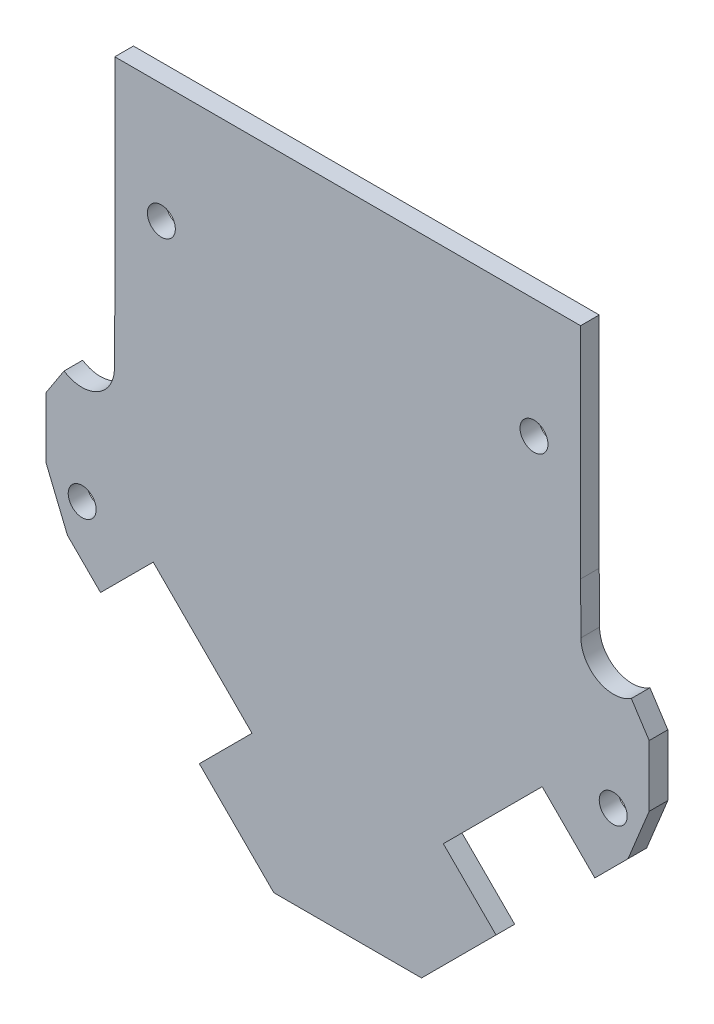
ISO-10303-21;
HEADER;
FILE_DESCRIPTION(('STEP AP214'),'2;1');
FILE_NAME('part.step','',(''),(''),'','','');
FILE_SCHEMA(('AUTOMOTIVE_DESIGN { 1 0 10303 214 1 1 1 1 }'));
ENDSEC;
DATA;
#1=APPLICATION_CONTEXT('core data for automotive mechanical design processes');
#2=APPLICATION_PROTOCOL_DEFINITION('international standard','automotive_design',2000,#1);
#3=PRODUCT_CONTEXT('',#1,'mechanical');
#4=PRODUCT('Part','Part','',(#3));
#5=PRODUCT_RELATED_PRODUCT_CATEGORY('part','',(#4));
#6=PRODUCT_DEFINITION_FORMATION('','',#4);
#7=PRODUCT_DEFINITION_CONTEXT('part definition',#1,'design');
#8=PRODUCT_DEFINITION('design','',#6,#7);
#9=PRODUCT_DEFINITION_SHAPE('','',#8);
#10=(LENGTH_UNIT() NAMED_UNIT(*) SI_UNIT(.MILLI.,.METRE.));
#11=(NAMED_UNIT(*) PLANE_ANGLE_UNIT() SI_UNIT($,.RADIAN.));
#12=(NAMED_UNIT(*) SI_UNIT($,.STERADIAN.) SOLID_ANGLE_UNIT());
#13=UNCERTAINTY_MEASURE_WITH_UNIT(LENGTH_MEASURE(1.E-05),#10,'distance_accuracy_value','');
#14=(GEOMETRIC_REPRESENTATION_CONTEXT(3) GLOBAL_UNCERTAINTY_ASSIGNED_CONTEXT((#13)) GLOBAL_UNIT_ASSIGNED_CONTEXT((#10,
#11,#12)) REPRESENTATION_CONTEXT('',''));
#15=CARTESIAN_POINT('',(0.,0.,0.));
#16=DIRECTION('',(0.,0.,1.));
#17=DIRECTION('',(1.,0.,0.));
#18=AXIS2_PLACEMENT_3D('',#15,#16,#17);
#19=CARTESIAN_POINT('',(15.,26.3525492114366,-37.569097949596));
#20=DIRECTION('',(-0.838670567945423,-0.544639035015028,0.));
#21=DIRECTION('',(0.544639035015028,-0.838670567945423,0.));
#22=AXIS2_PLACEMENT_3D('',#19,#20,#21);
#23=PLANE('',#22);
#24=DIRECTION('',(-0.544639035015028,0.838670567945423,0.));
#25=VECTOR('',#24,1.);
#26=CARTESIAN_POINT('',(15.,26.3525492114366,0.));
#27=LINE('',#26,#25);
#28=CARTESIAN_POINT('',(32.3636788836174,-0.385171544372863,0.));
#29=VERTEX_POINT('',#28);
#30=CARTESIAN_POINT('',(30.4463903501503,2.5671938938366,0.));
#31=VERTEX_POINT('',#30);
#32=EDGE_CURVE('E228',#29,#31,#27,.T.);
#33=ORIENTED_EDGE('',*,*,#32,.T.);
#34=DIRECTION('',(0.,0.,-1.));
#35=VECTOR('',#34,1.);
#36=CARTESIAN_POINT('',(30.4463903501503,2.5671938938366,12.4780718776263));
#37=LINE('',#36,#35);
#38=CARTESIAN_POINT('',(30.4463903501503,2.5671938938366,2.));
#39=VERTEX_POINT('',#38);
#40=EDGE_CURVE('E406',#39,#31,#37,.T.);
#41=ORIENTED_EDGE('',*,*,#40,.F.);
#42=DIRECTION('',(0.544639035015028,-0.838670567945423,0.));
#43=VECTOR('',#42,1.);
#44=CARTESIAN_POINT('',(15.,26.3525492114366,2.));
#45=LINE('',#44,#43);
#46=CARTESIAN_POINT('',(32.3636788836174,-0.385171544372863,2.));
#47=VERTEX_POINT('',#46);
#48=EDGE_CURVE('E379',#39,#47,#45,.T.);
#49=ORIENTED_EDGE('',*,*,#48,.T.);
#50=DIRECTION('',(0.,0.,1.));
#51=VECTOR('',#50,1.);
#52=CARTESIAN_POINT('',(32.3636788836174,-0.385171544372863,-37.569097949596));
#53=LINE('',#52,#51);
#54=EDGE_CURVE('E226',#29,#47,#53,.T.);
#55=ORIENTED_EDGE('',*,*,#54,.F.);
#56=EDGE_LOOP('',(#33,#41,#49,#55));
#57=FACE_BOUND('',#56,.T.);
#58=ADVANCED_FACE('F34',(#57),#23,.F.);
#59=CARTESIAN_POINT('',(-26.8116515749497,-4.68834842505034,2.));
#60=DIRECTION('',(0.,0.,1.));
#61=DIRECTION('',(1.,0.,0.));
#62=AXIS2_PLACEMENT_3D('',#59,#60,#61);
#63=PLANE('',#62);
#64=DIRECTION('',(-1.,0.,0.));
#65=VECTOR('',#64,1.);
#66=CARTESIAN_POINT('',(-25.,34.5,2.));
#67=LINE('',#66,#65);
#68=CARTESIAN_POINT('',(25.,34.5,2.));
#69=VERTEX_POINT('',#68);
#70=CARTESIAN_POINT('',(-25.,34.5,2.));
#71=VERTEX_POINT('',#70);
#72=EDGE_CURVE('E49',#69,#71,#67,.T.);
#73=ORIENTED_EDGE('',*,*,#72,.T.);
#74=DIRECTION('',(0.,-1.,0.));
#75=VECTOR('',#74,1.);
#76=CARTESIAN_POINT('',(-25.,10.9538995732908,2.));
#77=LINE('',#76,#75);
#78=CARTESIAN_POINT('',(-25.,10.9538995732908,2.));
#79=VERTEX_POINT('',#78);
#80=EDGE_CURVE('E210',#71,#79,#77,.T.);
#81=ORIENTED_EDGE('',*,*,#80,.T.);
#82=DIRECTION('',(-0.00736562032271967,-0.999972873450706,0.));
#83=VECTOR('',#82,1.);
#84=CARTESIAN_POINT('',(-25.,10.9538995732908,2.));
#85=LINE('',#84,#83);
#86=CARTESIAN_POINT('',(-25.0401537275977,5.50254088164555,2.));
#87=VERTEX_POINT('',#86);
#88=EDGE_CURVE('E419',#79,#87,#85,.T.);
#89=ORIENTED_EDGE('',*,*,#88,.T.);
#90=CARTESIAN_POINT('',(-28.5401537275977,5.50254088164557,2.));
#91=DIRECTION('',(0.,0.,1.));
#92=DIRECTION('',(1.,0.,0.));
#93=AXIS2_PLACEMENT_3D('',#90,#91,#92);
#94=CIRCLE('',#93,3.5);
#95=CARTESIAN_POINT('',(-30.4463903501503,2.56719389383659,2.));
#96=VERTEX_POINT('',#95);
#97=EDGE_CURVE('E295',#87,#96,#94,.F.);
#98=ORIENTED_EDGE('',*,*,#97,.T.);
#99=DIRECTION('',(-0.544639035015028,-0.838670567945423,0.));
#100=VECTOR('',#99,1.);
#101=CARTESIAN_POINT('',(-15.,26.3525492114366,2.));
#102=LINE('',#101,#100);
#103=CARTESIAN_POINT('',(-32.3636788836174,-0.385171544372863,2.));
#104=VERTEX_POINT('',#103);
#105=EDGE_CURVE('E238',#96,#104,#102,.T.);
#106=ORIENTED_EDGE('',*,*,#105,.T.);
#107=DIRECTION('',(0.,-1.,0.));
#108=VECTOR('',#107,1.);
#109=CARTESIAN_POINT('',(-32.3636788836174,-0.385171544372863,2.));
#110=LINE('',#109,#108);
#111=CARTESIAN_POINT('',(-32.3636788836174,-6.96320946779738,2.));
#112=VERTEX_POINT('',#111);
#113=EDGE_CURVE('E249',#104,#112,#110,.T.);
#114=ORIENTED_EDGE('',*,*,#113,.T.);
#115=DIRECTION('',(0.379143507124506,-0.925337884777949,0.));
#116=VECTOR('',#115,1.);
#117=CARTESIAN_POINT('',(-32.3636788836174,-6.96320946779738,2.));
#118=LINE('',#117,#116);
#119=CARTESIAN_POINT('',(-30.0888178408704,-12.5152367764651,2.));
#120=VERTEX_POINT('',#119);
#121=EDGE_CURVE('E275',#112,#120,#118,.T.);
#122=ORIENTED_EDGE('',*,*,#121,.T.);
#123=DIRECTION('',(0.707106781186547,-0.707106781186547,0.));
#124=VECTOR('',#123,1.);
#125=CARTESIAN_POINT('',(-30.0888178408704,-12.5152367764651,2.));
#126=LINE('',#125,#124);
#127=CARTESIAN_POINT('',(-26.5310394018942,-16.0730152154413,2.));
#128=VERTEX_POINT('',#127);
#129=EDGE_CURVE('E232',#120,#128,#126,.T.);
#130=ORIENTED_EDGE('',*,*,#129,.T.);
#131=DIRECTION('',(0.707106781186548,0.707106781186547,0.));
#132=VECTOR('',#131,1.);
#133=CARTESIAN_POINT('',(-26.5310394018942,-16.0730152154413,2.));
#134=LINE('',#133,#132);
#135=CARTESIAN_POINT('',(-20.8741851524018,-10.4161609659489,2.));
#136=VERTEX_POINT('',#135);
#137=EDGE_CURVE('E312',#128,#136,#134,.T.);
#138=ORIENTED_EDGE('',*,*,#137,.T.);
#139=DIRECTION('',(0.707106781186547,-0.707106781186548,0.));
#140=VECTOR('',#139,1.);
#141=CARTESIAN_POINT('',(-20.8741851524018,-10.4161609659489,2.));
#142=LINE('',#141,#140);
#143=CARTESIAN_POINT('',(-10.2675834346036,-21.0227626837471,2.));
#144=VERTEX_POINT('',#143);
#145=EDGE_CURVE('E314',#136,#144,#142,.T.);
#146=ORIENTED_EDGE('',*,*,#145,.T.);
#147=DIRECTION('',(-0.707106781186548,-0.707106781186547,0.));
#148=VECTOR('',#147,1.);
#149=CARTESIAN_POINT('',(-10.2675834346036,-21.0227626837471,2.));
#150=LINE('',#149,#148);
#151=CARTESIAN_POINT('',(-15.924437684096,-26.6796169332395,2.));
#152=VERTEX_POINT('',#151);
#153=EDGE_CURVE('E327',#144,#152,#150,.T.);
#154=ORIENTED_EDGE('',*,*,#153,.T.);
#155=DIRECTION('',(0.707106781186547,-0.707106781186548,0.));
#156=VECTOR('',#155,1.);
#157=CARTESIAN_POINT('',(-18.7528648088422,-23.8511898084933,2.));
#158=LINE('',#157,#156);
#159=CARTESIAN_POINT('',(-7.92893218813452,-34.6751224292009,2.));
#160=VERTEX_POINT('',#159);
#161=EDGE_CURVE('E218',#152,#160,#158,.T.);
#162=ORIENTED_EDGE('',*,*,#161,.T.);
#163=DIRECTION('',(1.,0.,0.));
#164=VECTOR('',#163,1.);
#165=CARTESIAN_POINT('',(25.1343436189669,-34.6751224292009,2.));
#166=LINE('',#165,#164);
#167=CARTESIAN_POINT('',(7.92893218813452,-34.6751224292009,2.));
#168=VERTEX_POINT('',#167);
#169=EDGE_CURVE('E350',#160,#168,#166,.T.);
#170=ORIENTED_EDGE('',*,*,#169,.T.);
#171=DIRECTION('',(-0.707106781186547,-0.707106781186548,0.));
#172=VECTOR('',#171,1.);
#173=CARTESIAN_POINT('',(18.7528648088422,-23.8511898084933,2.));
#174=LINE('',#173,#172);
#175=CARTESIAN_POINT('',(15.924437684096,-26.6796169332395,2.));
#176=VERTEX_POINT('',#175);
#177=EDGE_CURVE('E360',#176,#168,#174,.T.);
#178=ORIENTED_EDGE('',*,*,#177,.F.);
#179=DIRECTION('',(-0.707106781186547,0.707106781186548,0.));
#180=VECTOR('',#179,1.);
#181=CARTESIAN_POINT('',(10.2675834346036,-21.0227626837471,2.));
#182=LINE('',#181,#180);
#183=CARTESIAN_POINT('',(10.2675834346036,-21.0227626837471,2.));
#184=VERTEX_POINT('',#183);
#185=EDGE_CURVE('E57',#176,#184,#182,.T.);
#186=ORIENTED_EDGE('',*,*,#185,.T.);
#187=DIRECTION('',(0.707106781186548,0.707106781186547,0.));
#188=VECTOR('',#187,1.);
#189=CARTESIAN_POINT('',(20.8741851524018,-10.4161609659489,2.));
#190=LINE('',#189,#188);
#191=CARTESIAN_POINT('',(20.8741851524018,-10.4161609659489,2.));
#192=VERTEX_POINT('',#191);
#193=EDGE_CURVE('E439',#184,#192,#190,.T.);
#194=ORIENTED_EDGE('',*,*,#193,.T.);
#195=DIRECTION('',(0.707106781186547,-0.707106781186548,0.));
#196=VECTOR('',#195,1.);
#197=CARTESIAN_POINT('',(26.5310394018942,-16.0730152154413,2.));
#198=LINE('',#197,#196);
#199=CARTESIAN_POINT('',(26.5310394018942,-16.0730152154413,2.));
#200=VERTEX_POINT('',#199);
#201=EDGE_CURVE('E436',#192,#200,#198,.T.);
#202=ORIENTED_EDGE('',*,*,#201,.T.);
#203=DIRECTION('',(-0.707106781186547,-0.707106781186547,0.));
#204=VECTOR('',#203,1.);
#205=CARTESIAN_POINT('',(30.0888178408704,-12.5152367764651,2.));
#206=LINE('',#205,#204);
#207=CARTESIAN_POINT('',(30.0888178408704,-12.5152367764651,2.));
#208=VERTEX_POINT('',#207);
#209=EDGE_CURVE('E364',#208,#200,#206,.T.);
#210=ORIENTED_EDGE('',*,*,#209,.F.);
#211=DIRECTION('',(-0.379143507124506,-0.925337884777949,0.));
#212=VECTOR('',#211,1.);
#213=CARTESIAN_POINT('',(32.3636788836174,-6.96320946779738,2.));
#214=LINE('',#213,#212);
#215=CARTESIAN_POINT('',(32.3636788836174,-6.96320946779738,2.));
#216=VERTEX_POINT('',#215);
#217=EDGE_CURVE('E254',#216,#208,#214,.T.);
#218=ORIENTED_EDGE('',*,*,#217,.F.);
#219=DIRECTION('',(0.,-1.,0.));
#220=VECTOR('',#219,1.);
#221=CARTESIAN_POINT('',(32.3636788836174,-0.385171544372863,2.));
#222=LINE('',#221,#220);
#223=EDGE_CURVE('E371',#47,#216,#222,.T.);
#224=ORIENTED_EDGE('',*,*,#223,.F.);
#225=ORIENTED_EDGE('',*,*,#48,.F.);
#226=CARTESIAN_POINT('',(28.5401537275977,5.50254088164558,2.));
#227=DIRECTION('',(0.,0.,1.));
#228=DIRECTION('',(1.,0.,0.));
#229=AXIS2_PLACEMENT_3D('',#226,#227,#228);
#230=CIRCLE('',#229,3.5);
#231=CARTESIAN_POINT('',(25.0401537275977,5.50254088164558,2.));
#232=VERTEX_POINT('',#231);
#233=EDGE_CURVE('E408',#39,#232,#230,.F.);
#234=ORIENTED_EDGE('',*,*,#233,.T.);
#235=DIRECTION('',(-0.00736562032271908,0.999972873450706,0.));
#236=VECTOR('',#235,1.);
#237=CARTESIAN_POINT('',(25.,10.9538995732908,2.));
#238=LINE('',#237,#236);
#239=CARTESIAN_POINT('',(25.,10.9538995732908,2.));
#240=VERTEX_POINT('',#239);
#241=EDGE_CURVE('E409',#232,#240,#238,.T.);
#242=ORIENTED_EDGE('',*,*,#241,.T.);
#243=DIRECTION('',(0.,-1.,0.));
#244=VECTOR('',#243,1.);
#245=CARTESIAN_POINT('',(25.,10.9538995732908,2.));
#246=LINE('',#245,#244);
#247=EDGE_CURVE('E353',#69,#240,#246,.T.);
#248=ORIENTED_EDGE('',*,*,#247,.F.);
#249=EDGE_LOOP('',(#73,#81,#89,#98,#106,#114,#122,#130,#138,#146,#154,#162,#170,#178,#186,#194,
#202,#210,#218,#224,#225,#234,#242,#248));
#250=FACE_BOUND('',#249,.T.);
#251=CARTESIAN_POINT('',(20.,21.73,2.));
#252=DIRECTION('',(0.,0.,1.));
#253=DIRECTION('',(1.,0.,0.));
#254=AXIS2_PLACEMENT_3D('',#251,#252,#253);
#255=CIRCLE('',#254,1.5);
#256=CARTESIAN_POINT('',(21.5,21.73,2.));
#257=VERTEX_POINT('',#256);
#258=EDGE_CURVE('E336',#257,#257,#255,.T.);
#259=ORIENTED_EDGE('',*,*,#258,.F.);
#260=EDGE_LOOP('',(#259));
#261=FACE_BOUND('',#260,.T.);
#262=CARTESIAN_POINT('',(-20.,21.73,2.));
#263=DIRECTION('',(0.,0.,1.));
#264=DIRECTION('',(1.,0.,0.));
#265=AXIS2_PLACEMENT_3D('',#262,#263,#264);
#266=CIRCLE('',#265,1.5);
#267=CARTESIAN_POINT('',(-18.5,21.73,2.));
#268=VERTEX_POINT('',#267);
#269=EDGE_CURVE('E342',#268,#268,#266,.T.);
#270=ORIENTED_EDGE('',*,*,#269,.F.);
#271=EDGE_LOOP('',(#270));
#272=FACE_BOUND('',#271,.T.);
#273=CARTESIAN_POINT('',(28.5,-8.6,2.));
#274=DIRECTION('',(0.,0.,-1.));
#275=DIRECTION('',(-1.,0.,0.));
#276=AXIS2_PLACEMENT_3D('',#273,#274,#275);
#277=CIRCLE('',#276,1.5);
#278=CARTESIAN_POINT('',(27.,-8.6,2.));
#279=VERTEX_POINT('',#278);
#280=EDGE_CURVE('E247',#279,#279,#277,.T.);
#281=ORIENTED_EDGE('',*,*,#280,.T.);
#282=EDGE_LOOP('',(#281));
#283=FACE_BOUND('',#282,.T.);
#284=CARTESIAN_POINT('',(-28.5,-8.6,2.));
#285=DIRECTION('',(0.,0.,1.));
#286=DIRECTION('',(1.,0.,0.));
#287=AXIS2_PLACEMENT_3D('',#284,#285,#286);
#288=CIRCLE('',#287,1.5);
#289=CARTESIAN_POINT('',(-27.,-8.6,2.));
#290=VERTEX_POINT('',#289);
#291=EDGE_CURVE('E270',#290,#290,#288,.T.);
#292=ORIENTED_EDGE('',*,*,#291,.F.);
#293=EDGE_LOOP('',(#292));
#294=FACE_BOUND('',#293,.T.);
#295=ADVANCED_FACE('F290',(#250,#261,#272,#283,#294),#63,.T.);
#296=CARTESIAN_POINT('',(-26.8116515749497,-4.68834842505034,0.));
#297=DIRECTION('',(0.,0.,1.));
#298=DIRECTION('',(1.,0.,0.));
#299=AXIS2_PLACEMENT_3D('',#296,#297,#298);
#300=PLANE('',#299);
#301=CARTESIAN_POINT('',(20.,21.73,0.));
#302=DIRECTION('',(0.,0.,1.));
#303=DIRECTION('',(1.,0.,0.));
#304=AXIS2_PLACEMENT_3D('',#301,#302,#303);
#305=CIRCLE('',#304,1.5);
#306=CARTESIAN_POINT('',(21.5,21.73,0.));
#307=VERTEX_POINT('',#306);
#308=EDGE_CURVE('E339',#307,#307,#305,.F.);
#309=ORIENTED_EDGE('',*,*,#308,.F.);
#310=EDGE_LOOP('',(#309));
#311=FACE_BOUND('',#310,.T.);
#312=CARTESIAN_POINT('',(-20.,21.73,0.));
#313=DIRECTION('',(0.,0.,1.));
#314=DIRECTION('',(1.,0.,0.));
#315=AXIS2_PLACEMENT_3D('',#312,#313,#314);
#316=CIRCLE('',#315,1.5);
#317=CARTESIAN_POINT('',(-18.5,21.73,0.));
#318=VERTEX_POINT('',#317);
#319=EDGE_CURVE('E345',#318,#318,#316,.F.);
#320=ORIENTED_EDGE('',*,*,#319,.F.);
#321=EDGE_LOOP('',(#320));
#322=FACE_BOUND('',#321,.T.);
#323=DIRECTION('',(0.,1.,0.));
#324=VECTOR('',#323,1.);
#325=CARTESIAN_POINT('',(-25.,10.9538995732908,0.));
#326=LINE('',#325,#324);
#327=CARTESIAN_POINT('',(-25.,10.9538995732908,0.));
#328=VERTEX_POINT('',#327);
#329=CARTESIAN_POINT('',(-25.,34.5,0.));
#330=VERTEX_POINT('',#329);
#331=EDGE_CURVE('E209',#328,#330,#326,.T.);
#332=ORIENTED_EDGE('',*,*,#331,.T.);
#333=DIRECTION('',(-1.,0.,0.));
#334=VECTOR('',#333,1.);
#335=CARTESIAN_POINT('',(-25.,34.5,0.));
#336=LINE('',#335,#334);
#337=CARTESIAN_POINT('',(25.,34.5,0.));
#338=VERTEX_POINT('',#337);
#339=EDGE_CURVE('E194',#338,#330,#336,.T.);
#340=ORIENTED_EDGE('',*,*,#339,.F.);
#341=DIRECTION('',(0.,1.,0.));
#342=VECTOR('',#341,1.);
#343=CARTESIAN_POINT('',(25.,10.9538995732908,0.));
#344=LINE('',#343,#342);
#345=CARTESIAN_POINT('',(25.,10.9538995732908,0.));
#346=VERTEX_POINT('',#345);
#347=EDGE_CURVE('E358',#346,#338,#344,.T.);
#348=ORIENTED_EDGE('',*,*,#347,.F.);
#349=DIRECTION('',(-0.00736562032271908,0.999972873450706,0.));
#350=VECTOR('',#349,1.);
#351=CARTESIAN_POINT('',(25.,10.9538995732908,0.));
#352=LINE('',#351,#350);
#353=CARTESIAN_POINT('',(25.0401537275977,5.50254088164558,0.));
#354=VERTEX_POINT('',#353);
#355=EDGE_CURVE('E414',#354,#346,#352,.T.);
#356=ORIENTED_EDGE('',*,*,#355,.F.);
#357=CARTESIAN_POINT('',(28.5401537275977,5.50254088164558,0.));
#358=DIRECTION('',(0.,0.,-1.));
#359=DIRECTION('',(-1.,0.,0.));
#360=AXIS2_PLACEMENT_3D('',#357,#358,#359);
#361=CIRCLE('',#360,3.5);
#362=EDGE_CURVE('E211',#31,#354,#361,.T.);
#363=ORIENTED_EDGE('',*,*,#362,.F.);
#364=ORIENTED_EDGE('',*,*,#32,.F.);
#365=DIRECTION('',(0.,1.,0.));
#366=VECTOR('',#365,1.);
#367=CARTESIAN_POINT('',(32.3636788836174,-0.385171544372863,0.));
#368=LINE('',#367,#366);
#369=CARTESIAN_POINT('',(32.3636788836174,-6.96320946779738,0.));
#370=VERTEX_POINT('',#369);
#371=EDGE_CURVE('E374',#370,#29,#368,.T.);
#372=ORIENTED_EDGE('',*,*,#371,.F.);
#373=DIRECTION('',(0.379143507124506,0.925337884777949,0.));
#374=VECTOR('',#373,1.);
#375=CARTESIAN_POINT('',(32.3636788836174,-6.96320946779738,0.));
#376=LINE('',#375,#374);
#377=CARTESIAN_POINT('',(30.0888178408704,-12.5152367764651,0.));
#378=VERTEX_POINT('',#377);
#379=EDGE_CURVE('E260',#378,#370,#376,.T.);
#380=ORIENTED_EDGE('',*,*,#379,.F.);
#381=DIRECTION('',(0.707106781186548,0.707106781186548,0.));
#382=VECTOR('',#381,1.);
#383=CARTESIAN_POINT('',(30.0888178408704,-12.5152367764651,0.));
#384=LINE('',#383,#382);
#385=CARTESIAN_POINT('',(26.5310394018942,-16.0730152154413,0.));
#386=VERTEX_POINT('',#385);
#387=EDGE_CURVE('E369',#386,#378,#384,.T.);
#388=ORIENTED_EDGE('',*,*,#387,.F.);
#389=DIRECTION('',(0.707106781186547,-0.707106781186548,0.));
#390=VECTOR('',#389,1.);
#391=CARTESIAN_POINT('',(26.5310394018942,-16.0730152154413,0.));
#392=LINE('',#391,#390);
#393=CARTESIAN_POINT('',(20.8741851524018,-10.4161609659489,0.));
#394=VERTEX_POINT('',#393);
#395=EDGE_CURVE('E427',#394,#386,#392,.T.);
#396=ORIENTED_EDGE('',*,*,#395,.F.);
#397=DIRECTION('',(0.707106781186548,0.707106781186547,0.));
#398=VECTOR('',#397,1.);
#399=CARTESIAN_POINT('',(20.8741851524018,-10.4161609659489,0.));
#400=LINE('',#399,#398);
#401=CARTESIAN_POINT('',(10.2675834346036,-21.0227626837471,0.));
#402=VERTEX_POINT('',#401);
#403=EDGE_CURVE('E429',#402,#394,#400,.T.);
#404=ORIENTED_EDGE('',*,*,#403,.F.);
#405=DIRECTION('',(-0.707106781186547,0.707106781186548,0.));
#406=VECTOR('',#405,1.);
#407=CARTESIAN_POINT('',(10.2675834346036,-21.0227626837471,0.));
#408=LINE('',#407,#406);
#409=CARTESIAN_POINT('',(15.924437684096,-26.6796169332395,0.));
#410=VERTEX_POINT('',#409);
#411=EDGE_CURVE('E425',#410,#402,#408,.T.);
#412=ORIENTED_EDGE('',*,*,#411,.F.);
#413=DIRECTION('',(0.707106781186547,0.707106781186548,0.));
#414=VECTOR('',#413,1.);
#415=CARTESIAN_POINT('',(18.7528648088422,-23.8511898084933,0.));
#416=LINE('',#415,#414);
#417=CARTESIAN_POINT('',(7.92893218813455,-34.6751224292009,0.));
#418=VERTEX_POINT('',#417);
#419=EDGE_CURVE('E361',#418,#410,#416,.T.);
#420=ORIENTED_EDGE('',*,*,#419,.F.);
#421=DIRECTION('',(1.,0.,0.));
#422=VECTOR('',#421,1.);
#423=CARTESIAN_POINT('',(25.1343436189669,-34.6751224292009,0.));
#424=LINE('',#423,#422);
#425=CARTESIAN_POINT('',(-7.92893218813452,-34.6751224292009,0.));
#426=VERTEX_POINT('',#425);
#427=EDGE_CURVE('E348',#426,#418,#424,.T.);
#428=ORIENTED_EDGE('',*,*,#427,.F.);
#429=DIRECTION('',(-0.707106781186547,0.707106781186548,0.));
#430=VECTOR('',#429,1.);
#431=CARTESIAN_POINT('',(-18.7528648088422,-23.8511898084933,0.));
#432=LINE('',#431,#430);
#433=CARTESIAN_POINT('',(-15.924437684096,-26.6796169332395,0.));
#434=VERTEX_POINT('',#433);
#435=EDGE_CURVE('E230',#426,#434,#432,.T.);
#436=ORIENTED_EDGE('',*,*,#435,.T.);
#437=DIRECTION('',(-0.707106781186548,-0.707106781186547,0.));
#438=VECTOR('',#437,1.);
#439=CARTESIAN_POINT('',(-10.2675834346036,-21.0227626837471,0.));
#440=LINE('',#439,#438);
#441=CARTESIAN_POINT('',(-10.2675834346036,-21.0227626837471,0.));
#442=VERTEX_POINT('',#441);
#443=EDGE_CURVE('E318',#442,#434,#440,.T.);
#444=ORIENTED_EDGE('',*,*,#443,.F.);
#445=DIRECTION('',(0.707106781186547,-0.707106781186548,0.));
#446=VECTOR('',#445,1.);
#447=CARTESIAN_POINT('',(-20.8741851524018,-10.4161609659489,0.));
#448=LINE('',#447,#446);
#449=CARTESIAN_POINT('',(-20.8741851524018,-10.4161609659489,0.));
#450=VERTEX_POINT('',#449);
#451=EDGE_CURVE('E321',#450,#442,#448,.T.);
#452=ORIENTED_EDGE('',*,*,#451,.F.);
#453=DIRECTION('',(0.707106781186548,0.707106781186547,0.));
#454=VECTOR('',#453,1.);
#455=CARTESIAN_POINT('',(-26.5310394018942,-16.0730152154413,0.));
#456=LINE('',#455,#454);
#457=CARTESIAN_POINT('',(-26.5310394018942,-16.0730152154413,0.));
#458=VERTEX_POINT('',#457);
#459=EDGE_CURVE('E325',#458,#450,#456,.T.);
#460=ORIENTED_EDGE('',*,*,#459,.F.);
#461=DIRECTION('',(-0.707106781186548,0.707106781186548,0.));
#462=VECTOR('',#461,1.);
#463=CARTESIAN_POINT('',(-30.0888178408704,-12.5152367764651,0.));
#464=LINE('',#463,#462);
#465=CARTESIAN_POINT('',(-30.0888178408704,-12.5152367764651,0.));
#466=VERTEX_POINT('',#465);
#467=EDGE_CURVE('E236',#458,#466,#464,.T.);
#468=ORIENTED_EDGE('',*,*,#467,.T.);
#469=DIRECTION('',(-0.379143507124506,0.925337884777949,0.));
#470=VECTOR('',#469,1.);
#471=CARTESIAN_POINT('',(-32.3636788836174,-6.96320946779738,0.));
#472=LINE('',#471,#470);
#473=CARTESIAN_POINT('',(-32.3636788836174,-6.96320946779738,0.));
#474=VERTEX_POINT('',#473);
#475=EDGE_CURVE('E42',#466,#474,#472,.T.);
#476=ORIENTED_EDGE('',*,*,#475,.T.);
#477=DIRECTION('',(0.,1.,0.));
#478=VECTOR('',#477,1.);
#479=CARTESIAN_POINT('',(-32.3636788836174,-0.385171544372863,0.));
#480=LINE('',#479,#478);
#481=CARTESIAN_POINT('',(-32.3636788836174,-0.385171544372859,0.));
#482=VERTEX_POINT('',#481);
#483=EDGE_CURVE('E244',#474,#482,#480,.T.);
#484=ORIENTED_EDGE('',*,*,#483,.T.);
#485=DIRECTION('',(0.544639035015028,0.838670567945423,0.));
#486=VECTOR('',#485,1.);
#487=CARTESIAN_POINT('',(-15.,26.3525492114366,0.));
#488=LINE('',#487,#486);
#489=CARTESIAN_POINT('',(-30.4463903501503,2.56719389383659,0.));
#490=VERTEX_POINT('',#489);
#491=EDGE_CURVE('E241',#482,#490,#488,.T.);
#492=ORIENTED_EDGE('',*,*,#491,.T.);
#493=CARTESIAN_POINT('',(-28.5401537275977,5.50254088164557,0.));
#494=DIRECTION('',(0.,0.,-1.));
#495=DIRECTION('',(-1.,0.,0.));
#496=AXIS2_PLACEMENT_3D('',#493,#494,#495);
#497=CIRCLE('',#496,3.5);
#498=CARTESIAN_POINT('',(-25.0401537275977,5.50254088164555,0.));
#499=VERTEX_POINT('',#498);
#500=EDGE_CURVE('E301',#499,#490,#497,.T.);
#501=ORIENTED_EDGE('',*,*,#500,.F.);
#502=DIRECTION('',(-0.00736562032271968,-0.999972873450706,0.));
#503=VECTOR('',#502,1.);
#504=CARTESIAN_POINT('',(-25.,10.9538995732908,0.));
#505=LINE('',#504,#503);
#506=EDGE_CURVE('E217',#328,#499,#505,.T.);
#507=ORIENTED_EDGE('',*,*,#506,.F.);
#508=EDGE_LOOP('',(#332,#340,#348,#356,#363,#364,#372,#380,#388,#396,#404,#412,#420,#428,#436,
#444,#452,#460,#468,#476,#484,#492,#501,#507));
#509=FACE_BOUND('',#508,.T.);
#510=CARTESIAN_POINT('',(28.5,-8.6,0.));
#511=DIRECTION('',(0.,0.,1.));
#512=DIRECTION('',(1.,0.,0.));
#513=AXIS2_PLACEMENT_3D('',#510,#511,#512);
#514=CIRCLE('',#513,1.5);
#515=CARTESIAN_POINT('',(30.,-8.6,0.));
#516=VERTEX_POINT('',#515);
#517=EDGE_CURVE('E265',#516,#516,#514,.T.);
#518=ORIENTED_EDGE('',*,*,#517,.T.);
#519=EDGE_LOOP('',(#518));
#520=FACE_BOUND('',#519,.T.);
#521=CARTESIAN_POINT('',(-28.5,-8.6,0.));
#522=DIRECTION('',(0.,0.,1.));
#523=DIRECTION('',(1.,0.,0.));
#524=AXIS2_PLACEMENT_3D('',#521,#522,#523);
#525=CIRCLE('',#524,1.5);
#526=CARTESIAN_POINT('',(-27.,-8.6,0.));
#527=VERTEX_POINT('',#526);
#528=EDGE_CURVE('E11',#527,#527,#525,.F.);
#529=ORIENTED_EDGE('',*,*,#528,.F.);
#530=EDGE_LOOP('',(#529));
#531=FACE_BOUND('',#530,.T.);
#532=ADVANCED_FACE('F36',(#311,#322,#509,#520,#531),#300,.F.);
#533=CARTESIAN_POINT('',(-32.3636788836174,-6.96320946779738,-12.818513052528));
#534=DIRECTION('',(-0.925337884777949,-0.379143507124506,0.));
#535=DIRECTION('',(0.379143507124506,-0.925337884777949,0.));
#536=AXIS2_PLACEMENT_3D('',#533,#534,#535);
#537=PLANE('',#536);
#538=ORIENTED_EDGE('',*,*,#475,.F.);
#539=DIRECTION('',(0.,0.,1.));
#540=VECTOR('',#539,1.);
#541=CARTESIAN_POINT('',(-30.0888178408704,-12.5152367764651,-12.818513052528));
#542=LINE('',#541,#540);
#543=EDGE_CURVE('E272',#466,#120,#542,.T.);
#544=ORIENTED_EDGE('',*,*,#543,.T.);
#545=ORIENTED_EDGE('',*,*,#121,.F.);
#546=DIRECTION('',(0.,0.,1.));
#547=VECTOR('',#546,1.);
#548=CARTESIAN_POINT('',(-32.3636788836174,-6.96320946779738,-12.818513052528));
#549=LINE('',#548,#547);
#550=EDGE_CURVE('E278',#474,#112,#549,.T.);
#551=ORIENTED_EDGE('',*,*,#550,.F.);
#552=EDGE_LOOP('',(#538,#544,#545,#551));
#553=FACE_BOUND('',#552,.T.);
#554=ADVANCED_FACE('F305',(#553),#537,.T.);
#555=CARTESIAN_POINT('',(-28.5,-8.6,-12.818513052528));
#556=DIRECTION('',(0.,0.,1.));
#557=DIRECTION('',(1.,0.,0.));
#558=AXIS2_PLACEMENT_3D('',#555,#556,#557);
#559=CYLINDRICAL_SURFACE('',#558,1.5);
#560=ORIENTED_EDGE('',*,*,#528,.T.);
#561=EDGE_LOOP('',(#560));
#562=FACE_BOUND('',#561,.T.);
#563=ORIENTED_EDGE('',*,*,#291,.T.);
#564=EDGE_LOOP('',(#563));
#565=FACE_BOUND('',#564,.T.);
#566=ADVANCED_FACE('F510',(#562,#565),#559,.F.);
#567=CARTESIAN_POINT('',(32.3636788836174,-6.96320946779738,-12.818513052528));
#568=DIRECTION('',(-0.925337884777949,0.379143507124506,0.));
#569=DIRECTION('',(-0.379143507124506,-0.925337884777949,0.));
#570=AXIS2_PLACEMENT_3D('',#567,#568,#569);
#571=PLANE('',#570);
#572=DIRECTION('',(0.,0.,1.));
#573=VECTOR('',#572,1.);
#574=CARTESIAN_POINT('',(30.0888178408704,-12.5152367764651,-12.818513052528));
#575=LINE('',#574,#573);
#576=EDGE_CURVE('E256',#378,#208,#575,.T.);
#577=ORIENTED_EDGE('',*,*,#576,.F.);
#578=ORIENTED_EDGE('',*,*,#379,.T.);
#579=DIRECTION('',(0.,0.,1.));
#580=VECTOR('',#579,1.);
#581=CARTESIAN_POINT('',(32.3636788836174,-6.96320946779738,-12.818513052528));
#582=LINE('',#581,#580);
#583=EDGE_CURVE('E257',#370,#216,#582,.T.);
#584=ORIENTED_EDGE('',*,*,#583,.T.);
#585=ORIENTED_EDGE('',*,*,#217,.T.);
#586=EDGE_LOOP('',(#577,#578,#584,#585));
#587=FACE_BOUND('',#586,.T.);
#588=ADVANCED_FACE('F395',(#587),#571,.F.);
#589=CARTESIAN_POINT('',(28.5,-8.6,-12.818513052528));
#590=DIRECTION('',(0.,0.,1.));
#591=DIRECTION('',(1.,0.,0.));
#592=AXIS2_PLACEMENT_3D('',#589,#590,#591);
#593=CYLINDRICAL_SURFACE('',#592,1.5);
#594=ORIENTED_EDGE('',*,*,#517,.F.);
#595=EDGE_LOOP('',(#594));
#596=FACE_BOUND('',#595,.T.);
#597=ORIENTED_EDGE('',*,*,#280,.F.);
#598=EDGE_LOOP('',(#597));
#599=FACE_BOUND('',#598,.T.);
#600=ADVANCED_FACE('F505',(#596,#599),#593,.F.);
#601=CARTESIAN_POINT('',(-32.3636788836174,-0.385171544372863,-37.569097949596));
#602=DIRECTION('',(-1.,0.,0.));
#603=DIRECTION('',(0.,0.,1.));
#604=AXIS2_PLACEMENT_3D('',#601,#602,#603);
#605=PLANE('',#604);
#606=ORIENTED_EDGE('',*,*,#483,.F.);
#607=ORIENTED_EDGE('',*,*,#550,.T.);
#608=ORIENTED_EDGE('',*,*,#113,.F.);
#609=DIRECTION('',(0.,0.,1.));
#610=VECTOR('',#609,1.);
#611=CARTESIAN_POINT('',(-32.3636788836174,-0.385171544372863,-37.569097949596));
#612=LINE('',#611,#610);
#613=EDGE_CURVE('E245',#482,#104,#612,.T.);
#614=ORIENTED_EDGE('',*,*,#613,.F.);
#615=EDGE_LOOP('',(#606,#607,#608,#614));
#616=FACE_BOUND('',#615,.T.);
#617=ADVANCED_FACE('F285',(#616),#605,.T.);
#618=CARTESIAN_POINT('',(-15.,26.3525492114366,-37.569097949596));
#619=DIRECTION('',(-0.838670567945423,0.544639035015028,0.));
#620=DIRECTION('',(-0.544639035015028,-0.838670567945423,0.));
#621=AXIS2_PLACEMENT_3D('',#618,#619,#620);
#622=PLANE('',#621);
#623=DIRECTION('',(0.,0.,-1.));
#624=VECTOR('',#623,1.);
#625=CARTESIAN_POINT('',(-30.4463903501503,2.56719389383659,12.4780718776263));
#626=LINE('',#625,#624);
#627=EDGE_CURVE('E300',#96,#490,#626,.T.);
#628=ORIENTED_EDGE('',*,*,#627,.T.);
#629=ORIENTED_EDGE('',*,*,#491,.F.);
#630=ORIENTED_EDGE('',*,*,#613,.T.);
#631=ORIENTED_EDGE('',*,*,#105,.F.);
#632=EDGE_LOOP('',(#628,#629,#630,#631));
#633=FACE_BOUND('',#632,.T.);
#634=ADVANCED_FACE('F299',(#633),#622,.T.);
#635=CARTESIAN_POINT('',(-30.0888178408704,-12.5152367764651,-12.9075089815671));
#636=DIRECTION('',(-0.707106781186548,-0.707106781186548,0.));
#637=DIRECTION('',(0.707106781186548,-0.707106781186548,0.));
#638=AXIS2_PLACEMENT_3D('',#635,#636,#637);
#639=PLANE('',#638);
#640=DIRECTION('',(0.,0.,-1.));
#641=VECTOR('',#640,1.);
#642=CARTESIAN_POINT('',(-26.5310394018942,-16.0730152154413,25.));
#643=LINE('',#642,#641);
#644=EDGE_CURVE('E309',#128,#458,#643,.T.);
#645=ORIENTED_EDGE('',*,*,#644,.F.);
#646=ORIENTED_EDGE('',*,*,#129,.F.);
#647=ORIENTED_EDGE('',*,*,#543,.F.);
#648=ORIENTED_EDGE('',*,*,#467,.F.);
#649=EDGE_LOOP('',(#645,#646,#647,#648));
#650=FACE_BOUND('',#649,.T.);
#651=ADVANCED_FACE('F308',(#650),#639,.T.);
#652=CARTESIAN_POINT('',(-18.7528648088422,-23.8511898084933,-17.8983872764873));
#653=DIRECTION('',(-0.707106781186548,-0.707106781186547,0.));
#654=DIRECTION('',(0.707106781186547,-0.707106781186548,0.));
#655=AXIS2_PLACEMENT_3D('',#652,#653,#654);
#656=PLANE('',#655);
#657=DIRECTION('',(0.,0.,-1.));
#658=VECTOR('',#657,1.);
#659=CARTESIAN_POINT('',(-15.924437684096,-26.6796169332395,25.));
#660=LINE('',#659,#658);
#661=EDGE_CURVE('E329',#152,#434,#660,.T.);
#662=ORIENTED_EDGE('',*,*,#661,.T.);
#663=ORIENTED_EDGE('',*,*,#435,.F.);
#664=DIRECTION('',(0.,0.,1.));
#665=VECTOR('',#664,1.);
#666=CARTESIAN_POINT('',(-7.92893218813452,-34.6751224292009,-17.8983872764873));
#667=LINE('',#666,#665);
#668=EDGE_CURVE('E221',#426,#160,#667,.T.);
#669=ORIENTED_EDGE('',*,*,#668,.T.);
#670=ORIENTED_EDGE('',*,*,#161,.F.);
#671=EDGE_LOOP('',(#662,#663,#669,#670));
#672=FACE_BOUND('',#671,.T.);
#673=ADVANCED_FACE('F459',(#672),#656,.T.);
#674=CARTESIAN_POINT('',(-25.,10.9538995732908,-29.3050788894749));
#675=DIRECTION('',(-1.,0.,0.));
#676=DIRECTION('',(0.,0.,1.));
#677=AXIS2_PLACEMENT_3D('',#674,#675,#676);
#678=PLANE('',#677);
#679=DIRECTION('',(0.,0.,-1.));
#680=VECTOR('',#679,1.);
#681=CARTESIAN_POINT('',(-25.,34.5,52.1597448159378));
#682=LINE('',#681,#680);
#683=EDGE_CURVE('E197',#71,#330,#682,.T.);
#684=ORIENTED_EDGE('',*,*,#683,.T.);
#685=ORIENTED_EDGE('',*,*,#331,.F.);
#686=DIRECTION('',(0.,0.,1.));
#687=VECTOR('',#686,1.);
#688=CARTESIAN_POINT('',(-25.,10.9538995732908,-29.3050788894749));
#689=LINE('',#688,#687);
#690=EDGE_CURVE('E219',#328,#79,#689,.T.);
#691=ORIENTED_EDGE('',*,*,#690,.T.);
#692=ORIENTED_EDGE('',*,*,#80,.F.);
#693=EDGE_LOOP('',(#684,#685,#691,#692));
#694=FACE_BOUND('',#693,.T.);
#695=ADVANCED_FACE('F207',(#694),#678,.T.);
#696=CARTESIAN_POINT('',(32.3636788836174,-0.385171544372863,-37.569097949596));
#697=DIRECTION('',(-1.,0.,0.));
#698=DIRECTION('',(0.,0.,1.));
#699=AXIS2_PLACEMENT_3D('',#696,#697,#698);
#700=PLANE('',#699);
#701=ORIENTED_EDGE('',*,*,#583,.F.);
#702=ORIENTED_EDGE('',*,*,#371,.T.);
#703=ORIENTED_EDGE('',*,*,#54,.T.);
#704=ORIENTED_EDGE('',*,*,#223,.T.);
#705=EDGE_LOOP('',(#701,#702,#703,#704));
#706=FACE_BOUND('',#705,.T.);
#707=ADVANCED_FACE('F388',(#706),#700,.F.);
#708=CARTESIAN_POINT('',(30.0888178408704,-12.5152367764651,-12.9075089815671));
#709=DIRECTION('',(-0.707106781186548,0.707106781186548,0.));
#710=DIRECTION('',(-0.707106781186548,-0.707106781186548,0.));
#711=AXIS2_PLACEMENT_3D('',#708,#709,#710);
#712=PLANE('',#711);
#713=ORIENTED_EDGE('',*,*,#209,.T.);
#714=DIRECTION('',(0.,0.,-1.));
#715=VECTOR('',#714,1.);
#716=CARTESIAN_POINT('',(26.5310394018942,-16.0730152154413,25.));
#717=LINE('',#716,#715);
#718=EDGE_CURVE('E401',#200,#386,#717,.T.);
#719=ORIENTED_EDGE('',*,*,#718,.T.);
#720=ORIENTED_EDGE('',*,*,#387,.T.);
#721=ORIENTED_EDGE('',*,*,#576,.T.);
#722=EDGE_LOOP('',(#713,#719,#720,#721));
#723=FACE_BOUND('',#722,.T.);
#724=ADVANCED_FACE('F397',(#723),#712,.F.);
#725=CARTESIAN_POINT('',(18.7528648088422,-23.8511898084933,-17.8983872764873));
#726=DIRECTION('',(-0.707106781186548,0.707106781186547,0.));
#727=DIRECTION('',(-0.707106781186547,-0.707106781186548,0.));
#728=AXIS2_PLACEMENT_3D('',#725,#726,#727);
#729=PLANE('',#728);
#730=ORIENTED_EDGE('',*,*,#419,.T.);
#731=DIRECTION('',(0.,0.,-1.));
#732=VECTOR('',#731,1.);
#733=CARTESIAN_POINT('',(15.924437684096,-26.6796169332395,25.));
#734=LINE('',#733,#732);
#735=EDGE_CURVE('E443',#176,#410,#734,.T.);
#736=ORIENTED_EDGE('',*,*,#735,.F.);
#737=ORIENTED_EDGE('',*,*,#177,.T.);
#738=DIRECTION('',(0.,0.,1.));
#739=VECTOR('',#738,1.);
#740=CARTESIAN_POINT('',(7.92893218813452,-34.6751224292009,-17.8983872764873));
#741=LINE('',#740,#739);
#742=EDGE_CURVE('E365',#418,#168,#741,.T.);
#743=ORIENTED_EDGE('',*,*,#742,.F.);
#744=EDGE_LOOP('',(#730,#736,#737,#743));
#745=FACE_BOUND('',#744,.T.);
#746=ADVANCED_FACE('F467',(#745),#729,.F.);
#747=CARTESIAN_POINT('',(25.,10.9538995732908,-29.3050788894749));
#748=DIRECTION('',(-1.,0.,0.));
#749=DIRECTION('',(0.,0.,1.));
#750=AXIS2_PLACEMENT_3D('',#747,#748,#749);
#751=PLANE('',#750);
#752=ORIENTED_EDGE('',*,*,#347,.T.);
#753=DIRECTION('',(0.,0.,-1.));
#754=VECTOR('',#753,1.);
#755=CARTESIAN_POINT('',(25.,34.5,52.1597448159378));
#756=LINE('',#755,#754);
#757=EDGE_CURVE('E198',#69,#338,#756,.T.);
#758=ORIENTED_EDGE('',*,*,#757,.F.);
#759=ORIENTED_EDGE('',*,*,#247,.T.);
#760=DIRECTION('',(0.,0.,1.));
#761=VECTOR('',#760,1.);
#762=CARTESIAN_POINT('',(25.,10.9538995732908,-29.3050788894749));
#763=LINE('',#762,#761);
#764=EDGE_CURVE('E355',#346,#240,#763,.T.);
#765=ORIENTED_EDGE('',*,*,#764,.F.);
#766=EDGE_LOOP('',(#752,#758,#759,#765));
#767=FACE_BOUND('',#766,.T.);
#768=ADVANCED_FACE('F547',(#767),#751,.F.);
#769=CARTESIAN_POINT('',(25.1343436189669,-34.6751224292009,59.8541473257921));
#770=DIRECTION('',(0.,1.,0.));
#771=DIRECTION('',(0.,0.,1.));
#772=AXIS2_PLACEMENT_3D('',#769,#770,#771);
#773=PLANE('',#772);
#774=ORIENTED_EDGE('',*,*,#668,.F.);
#775=ORIENTED_EDGE('',*,*,#427,.T.);
#776=ORIENTED_EDGE('',*,*,#742,.T.);
#777=ORIENTED_EDGE('',*,*,#169,.F.);
#778=EDGE_LOOP('',(#774,#775,#776,#777));
#779=FACE_BOUND('',#778,.T.);
#780=ADVANCED_FACE('F463',(#779),#773,.F.);
#781=CARTESIAN_POINT('',(-20.,21.73,-4.24264068711929));
#782=DIRECTION('',(0.,0.,1.));
#783=DIRECTION('',(1.,0.,0.));
#784=AXIS2_PLACEMENT_3D('',#781,#782,#783);
#785=CYLINDRICAL_SURFACE('',#784,1.5);
#786=ORIENTED_EDGE('',*,*,#319,.T.);
#787=EDGE_LOOP('',(#786));
#788=FACE_BOUND('',#787,.T.);
#789=ORIENTED_EDGE('',*,*,#269,.T.);
#790=EDGE_LOOP('',(#789));
#791=FACE_BOUND('',#790,.T.);
#792=ADVANCED_FACE('F528',(#788,#791),#785,.F.);
#793=CARTESIAN_POINT('',(20.,21.73,-4.24264068711929));
#794=DIRECTION('',(0.,0.,1.));
#795=DIRECTION('',(1.,0.,0.));
#796=AXIS2_PLACEMENT_3D('',#793,#794,#795);
#797=CYLINDRICAL_SURFACE('',#796,1.5);
#798=ORIENTED_EDGE('',*,*,#308,.T.);
#799=EDGE_LOOP('',(#798));
#800=FACE_BOUND('',#799,.T.);
#801=ORIENTED_EDGE('',*,*,#258,.T.);
#802=EDGE_LOOP('',(#801));
#803=FACE_BOUND('',#802,.T.);
#804=ADVANCED_FACE('F531',(#800,#803),#797,.F.);
#805=CARTESIAN_POINT('',(-26.5310394018942,-16.0730152154413,25.));
#806=DIRECTION('',(-0.707106781186547,0.707106781186548,0.));
#807=DIRECTION('',(-0.707106781186548,-0.707106781186547,0.));
#808=AXIS2_PLACEMENT_3D('',#805,#806,#807);
#809=PLANE('',#808);
#810=ORIENTED_EDGE('',*,*,#644,.T.);
#811=ORIENTED_EDGE('',*,*,#459,.T.);
#812=DIRECTION('',(0.,0.,-1.));
#813=VECTOR('',#812,1.);
#814=CARTESIAN_POINT('',(-20.8741851524018,-10.4161609659489,25.));
#815=LINE('',#814,#813);
#816=EDGE_CURVE('E317',#136,#450,#815,.T.);
#817=ORIENTED_EDGE('',*,*,#816,.F.);
#818=ORIENTED_EDGE('',*,*,#137,.F.);
#819=EDGE_LOOP('',(#810,#811,#817,#818));
#820=FACE_BOUND('',#819,.T.);
#821=ADVANCED_FACE('F452',(#820),#809,.F.);
#822=CARTESIAN_POINT('',(-20.8741851524018,-10.4161609659489,25.));
#823=DIRECTION('',(0.707106781186548,0.707106781186547,0.));
#824=DIRECTION('',(-0.707106781186547,0.707106781186548,0.));
#825=AXIS2_PLACEMENT_3D('',#822,#823,#824);
#826=PLANE('',#825);
#827=ORIENTED_EDGE('',*,*,#816,.T.);
#828=ORIENTED_EDGE('',*,*,#451,.T.);
#829=DIRECTION('',(0.,0.,-1.));
#830=VECTOR('',#829,1.);
#831=CARTESIAN_POINT('',(-10.2675834346036,-21.0227626837471,25.));
#832=LINE('',#831,#830);
#833=EDGE_CURVE('E330',#144,#442,#832,.T.);
#834=ORIENTED_EDGE('',*,*,#833,.F.);
#835=ORIENTED_EDGE('',*,*,#145,.F.);
#836=EDGE_LOOP('',(#827,#828,#834,#835));
#837=FACE_BOUND('',#836,.T.);
#838=ADVANCED_FACE('F721',(#837),#826,.F.);
#839=CARTESIAN_POINT('',(-10.2675834346036,-21.0227626837471,25.));
#840=DIRECTION('',(0.707106781186547,-0.707106781186548,0.));
#841=DIRECTION('',(0.707106781186548,0.707106781186547,0.));
#842=AXIS2_PLACEMENT_3D('',#839,#840,#841);
#843=PLANE('',#842);
#844=ORIENTED_EDGE('',*,*,#833,.T.);
#845=ORIENTED_EDGE('',*,*,#443,.T.);
#846=ORIENTED_EDGE('',*,*,#661,.F.);
#847=ORIENTED_EDGE('',*,*,#153,.F.);
#848=EDGE_LOOP('',(#844,#845,#846,#847));
#849=FACE_BOUND('',#848,.T.);
#850=ADVANCED_FACE('F456',(#849),#843,.F.);
#851=CARTESIAN_POINT('',(10.2675834346036,-21.0227626837471,25.));
#852=DIRECTION('',(-0.707106781186548,-0.707106781186547,0.));
#853=DIRECTION('',(0.707106781186547,-0.707106781186548,0.));
#854=AXIS2_PLACEMENT_3D('',#851,#852,#853);
#855=PLANE('',#854);
#856=ORIENTED_EDGE('',*,*,#735,.T.);
#857=ORIENTED_EDGE('',*,*,#411,.T.);
#858=DIRECTION('',(0.,0.,-1.));
#859=VECTOR('',#858,1.);
#860=CARTESIAN_POINT('',(10.2675834346036,-21.0227626837471,25.));
#861=LINE('',#860,#859);
#862=EDGE_CURVE('E435',#184,#402,#861,.T.);
#863=ORIENTED_EDGE('',*,*,#862,.F.);
#864=ORIENTED_EDGE('',*,*,#185,.F.);
#865=EDGE_LOOP('',(#856,#857,#863,#864));
#866=FACE_BOUND('',#865,.T.);
#867=ADVANCED_FACE('F471',(#866),#855,.F.);
#868=CARTESIAN_POINT('',(20.8741851524018,-10.4161609659489,25.));
#869=DIRECTION('',(-0.707106781186547,0.707106781186548,0.));
#870=DIRECTION('',(-0.707106781186548,-0.707106781186547,0.));
#871=AXIS2_PLACEMENT_3D('',#868,#869,#870);
#872=PLANE('',#871);
#873=ORIENTED_EDGE('',*,*,#862,.T.);
#874=ORIENTED_EDGE('',*,*,#403,.T.);
#875=DIRECTION('',(0.,0.,-1.));
#876=VECTOR('',#875,1.);
#877=CARTESIAN_POINT('',(20.8741851524018,-10.4161609659489,25.));
#878=LINE('',#877,#876);
#879=EDGE_CURVE('E438',#192,#394,#878,.T.);
#880=ORIENTED_EDGE('',*,*,#879,.F.);
#881=ORIENTED_EDGE('',*,*,#193,.F.);
#882=EDGE_LOOP('',(#873,#874,#880,#881));
#883=FACE_BOUND('',#882,.T.);
#884=ADVANCED_FACE('F470',(#883),#872,.F.);
#885=CARTESIAN_POINT('',(26.5310394018942,-16.0730152154413,25.));
#886=DIRECTION('',(0.707106781186548,0.707106781186547,0.));
#887=DIRECTION('',(-0.707106781186547,0.707106781186548,0.));
#888=AXIS2_PLACEMENT_3D('',#885,#886,#887);
#889=PLANE('',#888);
#890=ORIENTED_EDGE('',*,*,#879,.T.);
#891=ORIENTED_EDGE('',*,*,#395,.T.);
#892=ORIENTED_EDGE('',*,*,#718,.F.);
#893=ORIENTED_EDGE('',*,*,#201,.F.);
#894=EDGE_LOOP('',(#890,#891,#892,#893));
#895=FACE_BOUND('',#894,.T.);
#896=ADVANCED_FACE('F475',(#895),#889,.F.);
#897=CARTESIAN_POINT('',(-25.,10.9538995732908,12.4780718776263));
#898=DIRECTION('',(0.999972873450706,-0.00736562032271967,0.));
#899=DIRECTION('',(0.00736562032271967,0.999972873450706,0.));
#900=AXIS2_PLACEMENT_3D('',#897,#898,#899);
#901=PLANE('',#900);
#902=ORIENTED_EDGE('',*,*,#690,.F.);
#903=ORIENTED_EDGE('',*,*,#506,.T.);
#904=DIRECTION('',(0.,0.,-1.));
#905=VECTOR('',#904,1.);
#906=CARTESIAN_POINT('',(-25.0401537275977,5.50254088164555,12.4780718776263));
#907=LINE('',#906,#905);
#908=EDGE_CURVE('E422',#87,#499,#907,.T.);
#909=ORIENTED_EDGE('',*,*,#908,.F.);
#910=ORIENTED_EDGE('',*,*,#88,.F.);
#911=EDGE_LOOP('',(#902,#903,#909,#910));
#912=FACE_BOUND('',#911,.T.);
#913=ADVANCED_FACE('F477',(#912),#901,.F.);
#914=CARTESIAN_POINT('',(-28.5401537275977,5.50254088164557,12.4780718776263));
#915=DIRECTION('',(0.,0.,-1.));
#916=DIRECTION('',(-1.,0.,0.));
#917=AXIS2_PLACEMENT_3D('',#914,#915,#916);
#918=CYLINDRICAL_SURFACE('',#917,3.5);
#919=ORIENTED_EDGE('',*,*,#908,.T.);
#920=ORIENTED_EDGE('',*,*,#500,.T.);
#921=ORIENTED_EDGE('',*,*,#627,.F.);
#922=ORIENTED_EDGE('',*,*,#97,.F.);
#923=EDGE_LOOP('',(#919,#920,#921,#922));
#924=FACE_BOUND('',#923,.T.);
#925=ADVANCED_FACE('F483',(#924),#918,.F.);
#926=CARTESIAN_POINT('',(25.,10.9538995732908,12.4780718776263));
#927=DIRECTION('',(-0.999972873450706,-0.00736562032271908,0.));
#928=DIRECTION('',(0.00736562032271908,-0.999972873450706,0.));
#929=AXIS2_PLACEMENT_3D('',#926,#927,#928);
#930=PLANE('',#929);
#931=DIRECTION('',(0.,0.,-1.));
#932=VECTOR('',#931,1.);
#933=CARTESIAN_POINT('',(25.0401537275977,5.50254088164558,12.4780718776263));
#934=LINE('',#933,#932);
#935=EDGE_CURVE('E411',#232,#354,#934,.T.);
#936=ORIENTED_EDGE('',*,*,#935,.T.);
#937=ORIENTED_EDGE('',*,*,#355,.T.);
#938=ORIENTED_EDGE('',*,*,#764,.T.);
#939=ORIENTED_EDGE('',*,*,#241,.F.);
#940=EDGE_LOOP('',(#936,#937,#938,#939));
#941=FACE_BOUND('',#940,.T.);
#942=ADVANCED_FACE('F804',(#941),#930,.F.);
#943=CARTESIAN_POINT('',(28.5401537275977,5.50254088164558,12.4780718776263));
#944=DIRECTION('',(0.,0.,-1.));
#945=DIRECTION('',(-1.,0.,0.));
#946=AXIS2_PLACEMENT_3D('',#943,#944,#945);
#947=CYLINDRICAL_SURFACE('',#946,3.5);
#948=ORIENTED_EDGE('',*,*,#40,.T.);
#949=ORIENTED_EDGE('',*,*,#362,.T.);
#950=ORIENTED_EDGE('',*,*,#935,.F.);
#951=ORIENTED_EDGE('',*,*,#233,.F.);
#952=EDGE_LOOP('',(#948,#949,#950,#951));
#953=FACE_BOUND('',#952,.T.);
#954=ADVANCED_FACE('F795',(#953),#947,.F.);
#955=CARTESIAN_POINT('',(-25.,34.5,52.1597448159378));
#956=DIRECTION('',(0.,-1.,0.));
#957=DIRECTION('',(1.,0.,0.));
#958=AXIS2_PLACEMENT_3D('',#955,#956,#957);
#959=PLANE('',#958);
#960=ORIENTED_EDGE('',*,*,#757,.T.);
#961=ORIENTED_EDGE('',*,*,#339,.T.);
#962=ORIENTED_EDGE('',*,*,#683,.F.);
#963=ORIENTED_EDGE('',*,*,#72,.F.);
#964=EDGE_LOOP('',(#960,#961,#962,#963));
#965=FACE_BOUND('',#964,.T.);
#966=ADVANCED_FACE('F196',(#965),#959,.F.);
#967=CLOSED_SHELL('',(#58,#295,#532,#554,#566,#588,#600,#617,#634,#651,#673,#695,#707,#724,#746,
#768,#780,#792,#804,#821,#838,#850,#867,#884,#896,#913,#925,#942,#954,#966));
#968=MANIFOLD_SOLID_BREP('B2',#967);
#969=ADVANCED_BREP_SHAPE_REPRESENTATION('',(#18,#968),#14);
#970=SHAPE_DEFINITION_REPRESENTATION(#9,#969);
ENDSEC;
END-ISO-10303-21;
